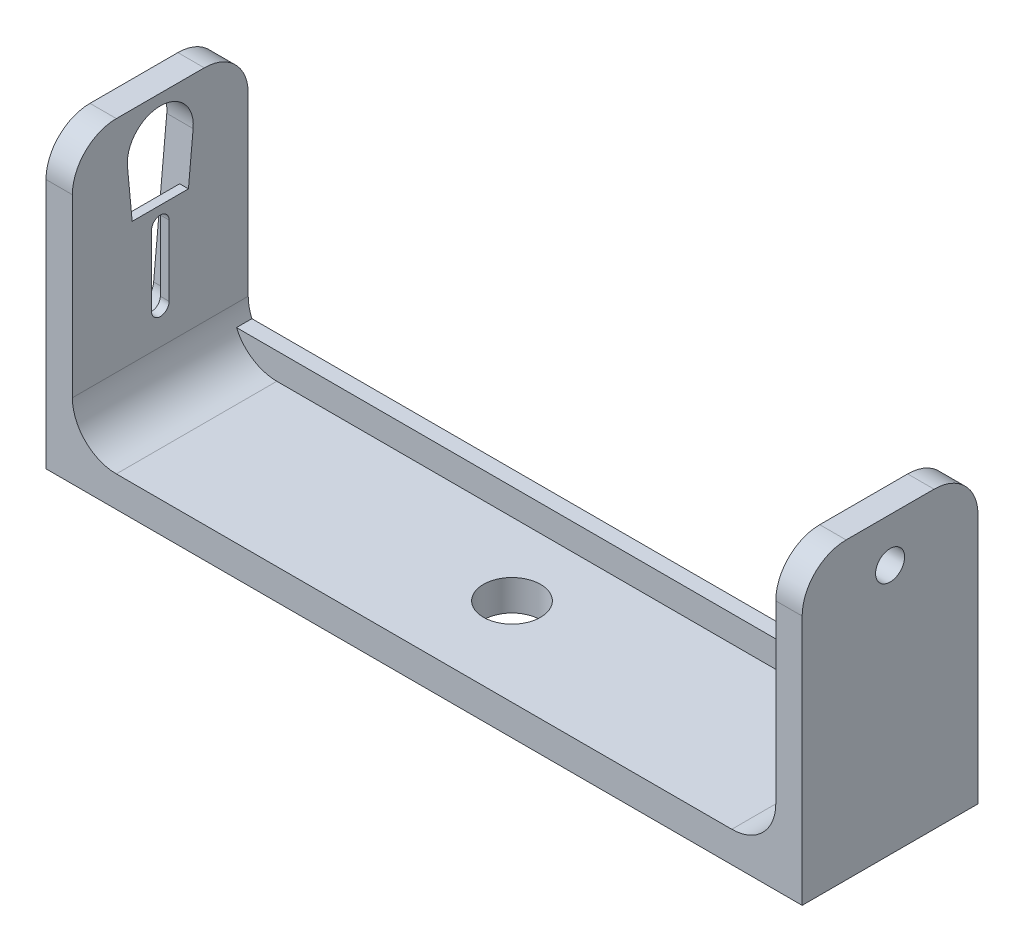
ISO-10303-21;
HEADER;
FILE_DESCRIPTION(('STEP AP214'),'2;1');
FILE_NAME('part.step','',(''),(''),'','','');
FILE_SCHEMA(('AUTOMOTIVE_DESIGN { 1 0 10303 214 1 1 1 1 }'));
ENDSEC;
DATA;
#1=APPLICATION_CONTEXT('core data for automotive mechanical design processes');
#2=APPLICATION_PROTOCOL_DEFINITION('international standard','automotive_design',2000,#1);
#3=PRODUCT_CONTEXT('',#1,'mechanical');
#4=PRODUCT('Part','Part','',(#3));
#5=PRODUCT_RELATED_PRODUCT_CATEGORY('part','',(#4));
#6=PRODUCT_DEFINITION_FORMATION('','',#4);
#7=PRODUCT_DEFINITION_CONTEXT('part definition',#1,'design');
#8=PRODUCT_DEFINITION('design','',#6,#7);
#9=PRODUCT_DEFINITION_SHAPE('','',#8);
#10=(LENGTH_UNIT() NAMED_UNIT(*) SI_UNIT(.MILLI.,.METRE.));
#11=(NAMED_UNIT(*) PLANE_ANGLE_UNIT() SI_UNIT($,.RADIAN.));
#12=(NAMED_UNIT(*) SI_UNIT($,.STERADIAN.) SOLID_ANGLE_UNIT());
#13=UNCERTAINTY_MEASURE_WITH_UNIT(LENGTH_MEASURE(1.E-05),#10,'distance_accuracy_value','');
#14=(GEOMETRIC_REPRESENTATION_CONTEXT(3) GLOBAL_UNCERTAINTY_ASSIGNED_CONTEXT((#13)) GLOBAL_UNIT_ASSIGNED_CONTEXT((#10,
#11,#12)) REPRESENTATION_CONTEXT('',''));
#15=CARTESIAN_POINT('',(0.,0.,0.));
#16=DIRECTION('',(0.,0.,1.));
#17=DIRECTION('',(1.,0.,0.));
#18=AXIS2_PLACEMENT_3D('',#15,#16,#17);
#19=CARTESIAN_POINT('',(0.,3.5,0.));
#20=DIRECTION('',(0.,1.,0.));
#21=DIRECTION('',(0.,0.,1.));
#22=AXIS2_PLACEMENT_3D('',#19,#20,#21);
#23=PLANE('',#22);
#24=CARTESIAN_POINT('',(0.,3.5,0.));
#25=DIRECTION('',(0.,1.,0.));
#26=DIRECTION('',(0.,0.,1.));
#27=AXIS2_PLACEMENT_3D('',#24,#25,#26);
#28=CIRCLE('',#27,3.25);
#29=CARTESIAN_POINT('',(0.,3.5,3.25));
#30=VERTEX_POINT('',#29);
#31=EDGE_CURVE('E399',#30,#30,#28,.T.);
#32=ORIENTED_EDGE('',*,*,#31,.F.);
#33=EDGE_LOOP('',(#32));
#34=FACE_BOUND('',#33,.T.);
#35=DIRECTION('',(0.,0.,1.));
#36=VECTOR('',#35,1.);
#37=CARTESIAN_POINT('',(35.,3.5,0.));
#38=LINE('',#37,#36);
#39=CARTESIAN_POINT('',(35.,3.5,10.));
#40=VERTEX_POINT('',#39);
#41=CARTESIAN_POINT('',(35.,3.5,-8.25));
#42=VERTEX_POINT('',#41);
#43=EDGE_CURVE('E221',#40,#42,#38,.F.);
#44=ORIENTED_EDGE('',*,*,#43,.T.);
#45=DIRECTION('',(1.,0.,0.));
#46=VECTOR('',#45,1.);
#47=CARTESIAN_POINT('',(-40.,3.5,-8.25));
#48=LINE('',#47,#46);
#49=CARTESIAN_POINT('',(-35.,3.5,-8.25));
#50=VERTEX_POINT('',#49);
#51=EDGE_CURVE('E207',#50,#42,#48,.T.);
#52=ORIENTED_EDGE('',*,*,#51,.F.);
#53=DIRECTION('',(0.,0.,-1.));
#54=VECTOR('',#53,1.);
#55=CARTESIAN_POINT('',(-35.,3.5,0.));
#56=LINE('',#55,#54);
#57=CARTESIAN_POINT('',(-35.,3.5,10.));
#58=VERTEX_POINT('',#57);
#59=EDGE_CURVE('E218',#50,#58,#56,.F.);
#60=ORIENTED_EDGE('',*,*,#59,.T.);
#61=DIRECTION('',(1.,0.,0.));
#62=VECTOR('',#61,1.);
#63=CARTESIAN_POINT('',(-43.,3.5,10.));
#64=LINE('',#63,#62);
#65=EDGE_CURVE('E406',#58,#40,#64,.T.);
#66=ORIENTED_EDGE('',*,*,#65,.T.);
#67=EDGE_LOOP('',(#44,#52,#60,#66));
#68=FACE_BOUND('',#67,.T.);
#69=ADVANCED_FACE('F33',(#34,#68),#23,.T.);
#70=CARTESIAN_POINT('',(-35.,8.5,-10.));
#71=DIRECTION('',(0.,0.,-1.));
#72=DIRECTION('',(-1.,0.,0.));
#73=AXIS2_PLACEMENT_3D('',#70,#71,#72);
#74=CYLINDRICAL_SURFACE('',#73,5.);
#75=CARTESIAN_POINT('',(-35.,8.5,-8.25));
#76=DIRECTION('',(0.,0.,-1.));
#77=DIRECTION('',(-1.,0.,0.));
#78=AXIS2_PLACEMENT_3D('',#75,#76,#77);
#79=CIRCLE('',#78,5.);
#80=CARTESIAN_POINT('',(-39.5825756949558,6.5,-8.25));
#81=VERTEX_POINT('',#80);
#82=EDGE_CURVE('E204',#81,#50,#79,.F.);
#83=ORIENTED_EDGE('',*,*,#82,.F.);
#84=DIRECTION('',(0.,0.,-1.));
#85=VECTOR('',#84,1.);
#86=CARTESIAN_POINT('',(-39.5825756949558,6.5,-10.));
#87=LINE('',#86,#85);
#88=CARTESIAN_POINT('',(-39.5825756949558,6.5,-10.));
#89=VERTEX_POINT('',#88);
#90=EDGE_CURVE('E213',#81,#89,#87,.T.);
#91=ORIENTED_EDGE('',*,*,#90,.T.);
#92=CARTESIAN_POINT('',(-35.,8.5,-10.));
#93=DIRECTION('',(0.,0.,1.));
#94=DIRECTION('',(1.,0.,0.));
#95=AXIS2_PLACEMENT_3D('',#92,#93,#94);
#96=CIRCLE('',#95,5.);
#97=CARTESIAN_POINT('',(-40.,8.5,-10.));
#98=VERTEX_POINT('',#97);
#99=EDGE_CURVE('E228',#98,#89,#96,.T.);
#100=ORIENTED_EDGE('',*,*,#99,.F.);
#101=DIRECTION('',(0.,0.,-1.));
#102=VECTOR('',#101,1.);
#103=CARTESIAN_POINT('',(-40.,8.5,-10.));
#104=LINE('',#103,#102);
#105=CARTESIAN_POINT('',(-40.,8.5,10.));
#106=VERTEX_POINT('',#105);
#107=EDGE_CURVE('E229',#106,#98,#104,.T.);
#108=ORIENTED_EDGE('',*,*,#107,.F.);
#109=CARTESIAN_POINT('',(-35.,8.5,10.));
#110=DIRECTION('',(0.,0.,-1.));
#111=DIRECTION('',(-1.,0.,0.));
#112=AXIS2_PLACEMENT_3D('',#109,#110,#111);
#113=CIRCLE('',#112,5.);
#114=EDGE_CURVE('E227',#58,#106,#113,.T.);
#115=ORIENTED_EDGE('',*,*,#114,.F.);
#116=ORIENTED_EDGE('',*,*,#59,.F.);
#117=EDGE_LOOP('',(#83,#91,#100,#108,#115,#116));
#118=FACE_BOUND('',#117,.T.);
#119=ADVANCED_FACE('F224',(#118),#74,.F.);
#120=CARTESIAN_POINT('',(35.,8.5,-10.));
#121=DIRECTION('',(0.,0.,1.));
#122=DIRECTION('',(1.,0.,0.));
#123=AXIS2_PLACEMENT_3D('',#120,#121,#122);
#124=CYLINDRICAL_SURFACE('',#123,5.);
#125=CARTESIAN_POINT('',(35.,8.5,-8.25));
#126=DIRECTION('',(0.,0.,-1.));
#127=DIRECTION('',(-1.,0.,0.));
#128=AXIS2_PLACEMENT_3D('',#125,#126,#127);
#129=CIRCLE('',#128,5.);
#130=CARTESIAN_POINT('',(39.5825756949558,6.5,-8.25));
#131=VERTEX_POINT('',#130);
#132=EDGE_CURVE('E11',#42,#131,#129,.F.);
#133=ORIENTED_EDGE('',*,*,#132,.F.);
#134=ORIENTED_EDGE('',*,*,#43,.F.);
#135=CARTESIAN_POINT('',(35.,8.5,10.));
#136=DIRECTION('',(0.,0.,-1.));
#137=DIRECTION('',(-1.,0.,0.));
#138=AXIS2_PLACEMENT_3D('',#135,#136,#137);
#139=CIRCLE('',#138,5.);
#140=CARTESIAN_POINT('',(40.,8.5,10.));
#141=VERTEX_POINT('',#140);
#142=EDGE_CURVE('E243',#141,#40,#139,.T.);
#143=ORIENTED_EDGE('',*,*,#142,.F.);
#144=DIRECTION('',(0.,0.,1.));
#145=VECTOR('',#144,1.);
#146=CARTESIAN_POINT('',(40.,8.5,-10.));
#147=LINE('',#146,#145);
#148=CARTESIAN_POINT('',(40.,8.5,-10.));
#149=VERTEX_POINT('',#148);
#150=EDGE_CURVE('E239',#149,#141,#147,.T.);
#151=ORIENTED_EDGE('',*,*,#150,.F.);
#152=CARTESIAN_POINT('',(35.,8.5,-10.));
#153=DIRECTION('',(0.,0.,1.));
#154=DIRECTION('',(1.,0.,0.));
#155=AXIS2_PLACEMENT_3D('',#152,#153,#154);
#156=CIRCLE('',#155,5.);
#157=CARTESIAN_POINT('',(39.5825756949558,6.5,-10.));
#158=VERTEX_POINT('',#157);
#159=EDGE_CURVE('E245',#158,#149,#156,.T.);
#160=ORIENTED_EDGE('',*,*,#159,.F.);
#161=DIRECTION('',(0.,0.,1.));
#162=VECTOR('',#161,1.);
#163=CARTESIAN_POINT('',(39.5825756949558,6.5,-10.));
#164=LINE('',#163,#162);
#165=EDGE_CURVE('E41',#158,#131,#164,.T.);
#166=ORIENTED_EDGE('',*,*,#165,.T.);
#167=EDGE_LOOP('',(#133,#134,#143,#151,#160,#166));
#168=FACE_BOUND('',#167,.T.);
#169=ADVANCED_FACE('F285',(#168),#124,.F.);
#170=CARTESIAN_POINT('',(43.,3.5,-10.));
#171=DIRECTION('',(-1.,0.,0.));
#172=DIRECTION('',(0.,0.,1.));
#173=AXIS2_PLACEMENT_3D('',#170,#171,#172);
#174=PLANE('',#173);
#175=CARTESIAN_POINT('',(43.,28.5,0.));
#176=DIRECTION('',(-1.,0.,0.));
#177=DIRECTION('',(0.,0.,1.));
#178=AXIS2_PLACEMENT_3D('',#175,#176,#177);
#179=CIRCLE('',#178,1.65);
#180=CARTESIAN_POINT('',(43.,28.5,1.65));
#181=VERTEX_POINT('',#180);
#182=EDGE_CURVE('E376',#181,#181,#179,.T.);
#183=ORIENTED_EDGE('',*,*,#182,.T.);
#184=EDGE_LOOP('',(#183));
#185=FACE_BOUND('',#184,.T.);
#186=DIRECTION('',(0.,-1.,0.));
#187=VECTOR('',#186,1.);
#188=CARTESIAN_POINT('',(43.,3.5,-10.));
#189=LINE('',#188,#187);
#190=CARTESIAN_POINT('',(43.,28.5,-10.));
#191=VERTEX_POINT('',#190);
#192=CARTESIAN_POINT('',(43.,0.,-10.));
#193=VERTEX_POINT('',#192);
#194=EDGE_CURVE('E234',#191,#193,#189,.T.);
#195=ORIENTED_EDGE('',*,*,#194,.F.);
#196=CARTESIAN_POINT('',(43.,28.5,-5.));
#197=DIRECTION('',(-1.,0.,0.));
#198=DIRECTION('',(0.,0.,1.));
#199=AXIS2_PLACEMENT_3D('',#196,#197,#198);
#200=CIRCLE('',#199,5.);
#201=CARTESIAN_POINT('',(43.,33.5,-5.));
#202=VERTEX_POINT('',#201);
#203=EDGE_CURVE('E263',#191,#202,#200,.F.);
#204=ORIENTED_EDGE('',*,*,#203,.T.);
#205=DIRECTION('',(0.,0.,-1.));
#206=VECTOR('',#205,1.);
#207=CARTESIAN_POINT('',(43.,33.5,-10.));
#208=LINE('',#207,#206);
#209=CARTESIAN_POINT('',(43.,33.5,5.));
#210=VERTEX_POINT('',#209);
#211=EDGE_CURVE('E389',#210,#202,#208,.T.);
#212=ORIENTED_EDGE('',*,*,#211,.F.);
#213=CARTESIAN_POINT('',(43.,28.5,5.));
#214=DIRECTION('',(-1.,0.,0.));
#215=DIRECTION('',(0.,0.,1.));
#216=AXIS2_PLACEMENT_3D('',#213,#214,#215);
#217=CIRCLE('',#216,5.);
#218=CARTESIAN_POINT('',(43.,28.5,10.));
#219=VERTEX_POINT('',#218);
#220=EDGE_CURVE('E261',#210,#219,#217,.F.);
#221=ORIENTED_EDGE('',*,*,#220,.T.);
#222=DIRECTION('',(0.,-1.,0.));
#223=VECTOR('',#222,1.);
#224=CARTESIAN_POINT('',(43.,3.5,10.));
#225=LINE('',#224,#223);
#226=CARTESIAN_POINT('',(43.,0.,10.));
#227=VERTEX_POINT('',#226);
#228=EDGE_CURVE('E408',#219,#227,#225,.T.);
#229=ORIENTED_EDGE('',*,*,#228,.T.);
#230=DIRECTION('',(0.,0.,-1.));
#231=VECTOR('',#230,1.);
#232=CARTESIAN_POINT('',(43.,0.,-10.));
#233=LINE('',#232,#231);
#234=EDGE_CURVE('E403',#227,#193,#233,.T.);
#235=ORIENTED_EDGE('',*,*,#234,.T.);
#236=EDGE_LOOP('',(#195,#204,#212,#221,#229,#235));
#237=FACE_BOUND('',#236,.T.);
#238=ADVANCED_FACE('F435',(#185,#237),#174,.F.);
#239=CARTESIAN_POINT('',(-43.,3.5,-10.));
#240=DIRECTION('',(0.,0.,1.));
#241=DIRECTION('',(1.,0.,0.));
#242=AXIS2_PLACEMENT_3D('',#239,#240,#241);
#243=PLANE('',#242);
#244=DIRECTION('',(-1.,0.,0.));
#245=VECTOR('',#244,1.);
#246=CARTESIAN_POINT('',(-40.,6.5,-10.));
#247=LINE('',#246,#245);
#248=EDGE_CURVE('E289',#158,#89,#247,.T.);
#249=ORIENTED_EDGE('',*,*,#248,.F.);
#250=ORIENTED_EDGE('',*,*,#159,.T.);
#251=DIRECTION('',(0.,-1.,0.));
#252=VECTOR('',#251,1.);
#253=CARTESIAN_POINT('',(40.,33.5,-10.));
#254=LINE('',#253,#252);
#255=CARTESIAN_POINT('',(40.,28.5,-10.));
#256=VERTEX_POINT('',#255);
#257=EDGE_CURVE('E397',#256,#149,#254,.T.);
#258=ORIENTED_EDGE('',*,*,#257,.F.);
#259=DIRECTION('',(-1.,0.,0.));
#260=VECTOR('',#259,1.);
#261=CARTESIAN_POINT('',(43.,28.5,-10.));
#262=LINE('',#261,#260);
#263=EDGE_CURVE('E259',#256,#191,#262,.F.);
#264=ORIENTED_EDGE('',*,*,#263,.T.);
#265=ORIENTED_EDGE('',*,*,#194,.T.);
#266=DIRECTION('',(-1.,0.,0.));
#267=VECTOR('',#266,1.);
#268=CARTESIAN_POINT('',(-43.,0.,-10.));
#269=LINE('',#268,#267);
#270=CARTESIAN_POINT('',(-43.,0.,-10.));
#271=VERTEX_POINT('',#270);
#272=EDGE_CURVE('E412',#193,#271,#269,.T.);
#273=ORIENTED_EDGE('',*,*,#272,.T.);
#274=DIRECTION('',(0.,-1.,0.));
#275=VECTOR('',#274,1.);
#276=CARTESIAN_POINT('',(-43.,3.5,-10.));
#277=LINE('',#276,#275);
#278=CARTESIAN_POINT('',(-43.,28.5,-10.));
#279=VERTEX_POINT('',#278);
#280=EDGE_CURVE('E423',#279,#271,#277,.T.);
#281=ORIENTED_EDGE('',*,*,#280,.F.);
#282=DIRECTION('',(-1.,0.,0.));
#283=VECTOR('',#282,1.);
#284=CARTESIAN_POINT('',(-43.,28.5,-10.));
#285=LINE('',#284,#283);
#286=CARTESIAN_POINT('',(-40.,28.5,-10.));
#287=VERTEX_POINT('',#286);
#288=EDGE_CURVE('E257',#279,#287,#285,.F.);
#289=ORIENTED_EDGE('',*,*,#288,.T.);
#290=DIRECTION('',(0.,-1.,0.));
#291=VECTOR('',#290,1.);
#292=CARTESIAN_POINT('',(-40.,33.5,-10.));
#293=LINE('',#292,#291);
#294=EDGE_CURVE('E385',#287,#98,#293,.T.);
#295=ORIENTED_EDGE('',*,*,#294,.T.);
#296=ORIENTED_EDGE('',*,*,#99,.T.);
#297=EDGE_LOOP('',(#249,#250,#258,#264,#265,#273,#281,#289,#295,#296));
#298=FACE_BOUND('',#297,.T.);
#299=ADVANCED_FACE('F291',(#298),#243,.F.);
#300=CARTESIAN_POINT('',(-43.,3.5,-10.));
#301=DIRECTION('',(1.,0.,0.));
#302=DIRECTION('',(0.,0.,-1.));
#303=AXIS2_PLACEMENT_3D('',#300,#301,#302);
#304=PLANE('',#303);
#305=CARTESIAN_POINT('',(-43.,12.5,0.));
#306=DIRECTION('',(-1.,0.,0.));
#307=DIRECTION('',(0.,0.,1.));
#308=AXIS2_PLACEMENT_3D('',#305,#306,#307);
#309=CIRCLE('',#308,2.25);
#310=CARTESIAN_POINT('',(-43.,12.2890625,-2.24009048279166));
#311=VERTEX_POINT('',#310);
#312=CARTESIAN_POINT('',(-43.,12.2890625,2.24009048279166));
#313=VERTEX_POINT('',#312);
#314=EDGE_CURVE('E357',#311,#313,#309,.T.);
#315=ORIENTED_EDGE('',*,*,#314,.F.);
#316=DIRECTION('',(0.,-0.995595770129625,0.0937499999999998));
#317=VECTOR('',#316,1.);
#318=CARTESIAN_POINT('',(-43.,-0.10107421875,-1.07337668967101));
#319=LINE('',#318,#317);
#320=CARTESIAN_POINT('',(-43.,28.1484375,-3.73348413798609));
#321=VERTEX_POINT('',#320);
#322=EDGE_CURVE('E316',#321,#311,#319,.T.);
#323=ORIENTED_EDGE('',*,*,#322,.F.);
#324=CARTESIAN_POINT('',(-43.,28.5,0.));
#325=DIRECTION('',(-1.,0.,0.));
#326=DIRECTION('',(0.,0.,1.));
#327=AXIS2_PLACEMENT_3D('',#324,#325,#326);
#328=CIRCLE('',#327,3.75);
#329=CARTESIAN_POINT('',(-43.,28.1484375,3.73348413798609));
#330=VERTEX_POINT('',#329);
#331=EDGE_CURVE('E350',#330,#321,#328,.T.);
#332=ORIENTED_EDGE('',*,*,#331,.F.);
#333=DIRECTION('',(0.,-0.995595770129624,-0.09375));
#334=VECTOR('',#333,1.);
#335=CARTESIAN_POINT('',(-43.,-0.10107421875,1.073376689671));
#336=LINE('',#335,#334);
#337=EDGE_CURVE('E360',#330,#313,#336,.T.);
#338=ORIENTED_EDGE('',*,*,#337,.T.);
#339=EDGE_LOOP('',(#315,#323,#332,#338));
#340=FACE_BOUND('',#339,.T.);
#341=DIRECTION('',(0.,0.,1.));
#342=VECTOR('',#341,1.);
#343=CARTESIAN_POINT('',(-43.,33.5,-10.));
#344=LINE('',#343,#342);
#345=CARTESIAN_POINT('',(-43.,33.5,-5.));
#346=VERTEX_POINT('',#345);
#347=CARTESIAN_POINT('',(-43.,33.5,5.));
#348=VERTEX_POINT('',#347);
#349=EDGE_CURVE('E379',#346,#348,#344,.T.);
#350=ORIENTED_EDGE('',*,*,#349,.F.);
#351=CARTESIAN_POINT('',(-43.,28.5,-5.));
#352=DIRECTION('',(1.,0.,0.));
#353=DIRECTION('',(0.,0.,-1.));
#354=AXIS2_PLACEMENT_3D('',#351,#352,#353);
#355=CIRCLE('',#354,5.);
#356=EDGE_CURVE('E277',#346,#279,#355,.F.);
#357=ORIENTED_EDGE('',*,*,#356,.T.);
#358=ORIENTED_EDGE('',*,*,#280,.T.);
#359=DIRECTION('',(0.,0.,1.));
#360=VECTOR('',#359,1.);
#361=CARTESIAN_POINT('',(-43.,0.,-10.));
#362=LINE('',#361,#360);
#363=CARTESIAN_POINT('',(-43.,0.,10.));
#364=VERTEX_POINT('',#363);
#365=EDGE_CURVE('E415',#271,#364,#362,.T.);
#366=ORIENTED_EDGE('',*,*,#365,.T.);
#367=DIRECTION('',(0.,-1.,0.));
#368=VECTOR('',#367,1.);
#369=CARTESIAN_POINT('',(-43.,3.5,10.));
#370=LINE('',#369,#368);
#371=CARTESIAN_POINT('',(-43.,28.5,10.));
#372=VERTEX_POINT('',#371);
#373=EDGE_CURVE('E421',#372,#364,#370,.T.);
#374=ORIENTED_EDGE('',*,*,#373,.F.);
#375=CARTESIAN_POINT('',(-43.,28.5,5.));
#376=DIRECTION('',(1.,0.,0.));
#377=DIRECTION('',(0.,0.,-1.));
#378=AXIS2_PLACEMENT_3D('',#375,#376,#377);
#379=CIRCLE('',#378,5.);
#380=EDGE_CURVE('E275',#372,#348,#379,.F.);
#381=ORIENTED_EDGE('',*,*,#380,.T.);
#382=EDGE_LOOP('',(#350,#357,#358,#366,#374,#381));
#383=FACE_BOUND('',#382,.T.);
#384=ADVANCED_FACE('F447',(#340,#383),#304,.F.);
#385=CARTESIAN_POINT('',(-43.,3.5,10.));
#386=DIRECTION('',(0.,0.,-1.));
#387=DIRECTION('',(-1.,0.,0.));
#388=AXIS2_PLACEMENT_3D('',#385,#386,#387);
#389=PLANE('',#388);
#390=ORIENTED_EDGE('',*,*,#228,.F.);
#391=DIRECTION('',(1.,0.,0.));
#392=VECTOR('',#391,1.);
#393=CARTESIAN_POINT('',(40.,28.5,10.));
#394=LINE('',#393,#392);
#395=CARTESIAN_POINT('',(40.,28.5,10.));
#396=VERTEX_POINT('',#395);
#397=EDGE_CURVE('E267',#219,#396,#394,.F.);
#398=ORIENTED_EDGE('',*,*,#397,.T.);
#399=DIRECTION('',(0.,-1.,0.));
#400=VECTOR('',#399,1.);
#401=CARTESIAN_POINT('',(40.,33.5,10.));
#402=LINE('',#401,#400);
#403=EDGE_CURVE('E395',#396,#141,#402,.T.);
#404=ORIENTED_EDGE('',*,*,#403,.T.);
#405=ORIENTED_EDGE('',*,*,#142,.T.);
#406=ORIENTED_EDGE('',*,*,#65,.F.);
#407=ORIENTED_EDGE('',*,*,#114,.T.);
#408=DIRECTION('',(0.,-1.,0.));
#409=VECTOR('',#408,1.);
#410=CARTESIAN_POINT('',(-40.,33.5,10.));
#411=LINE('',#410,#409);
#412=CARTESIAN_POINT('',(-40.,28.5,10.));
#413=VERTEX_POINT('',#412);
#414=EDGE_CURVE('E387',#413,#106,#411,.T.);
#415=ORIENTED_EDGE('',*,*,#414,.F.);
#416=DIRECTION('',(1.,0.,0.));
#417=VECTOR('',#416,1.);
#418=CARTESIAN_POINT('',(-43.,28.5,10.));
#419=LINE('',#418,#417);
#420=EDGE_CURVE('E265',#413,#372,#419,.F.);
#421=ORIENTED_EDGE('',*,*,#420,.T.);
#422=ORIENTED_EDGE('',*,*,#373,.T.);
#423=DIRECTION('',(1.,0.,0.));
#424=VECTOR('',#423,1.);
#425=CARTESIAN_POINT('',(-43.,0.,10.));
#426=LINE('',#425,#424);
#427=EDGE_CURVE('E409',#364,#227,#426,.T.);
#428=ORIENTED_EDGE('',*,*,#427,.T.);
#429=EDGE_LOOP('',(#390,#398,#404,#405,#406,#407,#415,#421,#422,#428));
#430=FACE_BOUND('',#429,.T.);
#431=ADVANCED_FACE('F440',(#430),#389,.F.);
#432=CARTESIAN_POINT('',(0.,0.,0.));
#433=DIRECTION('',(0.,1.,0.));
#434=DIRECTION('',(0.,0.,1.));
#435=AXIS2_PLACEMENT_3D('',#432,#433,#434);
#436=PLANE('',#435);
#437=CARTESIAN_POINT('',(0.,0.,0.));
#438=DIRECTION('',(0.,1.,0.));
#439=DIRECTION('',(0.,0.,1.));
#440=AXIS2_PLACEMENT_3D('',#437,#438,#439);
#441=CIRCLE('',#440,3.25);
#442=CARTESIAN_POINT('',(0.,0.,3.25));
#443=VERTEX_POINT('',#442);
#444=EDGE_CURVE('E400',#443,#443,#441,.T.);
#445=ORIENTED_EDGE('',*,*,#444,.T.);
#446=EDGE_LOOP('',(#445));
#447=FACE_BOUND('',#446,.T.);
#448=ORIENTED_EDGE('',*,*,#234,.F.);
#449=ORIENTED_EDGE('',*,*,#427,.F.);
#450=ORIENTED_EDGE('',*,*,#365,.F.);
#451=ORIENTED_EDGE('',*,*,#272,.F.);
#452=EDGE_LOOP('',(#448,#449,#450,#451));
#453=FACE_BOUND('',#452,.T.);
#454=ADVANCED_FACE('F433',(#447,#453),#436,.F.);
#455=CARTESIAN_POINT('',(0.,0.,0.));
#456=DIRECTION('',(0.,1.,0.));
#457=DIRECTION('',(0.,0.,1.));
#458=AXIS2_PLACEMENT_3D('',#455,#456,#457);
#459=CYLINDRICAL_SURFACE('',#458,3.25);
#460=ORIENTED_EDGE('',*,*,#444,.F.);
#461=EDGE_LOOP('',(#460));
#462=FACE_BOUND('',#461,.T.);
#463=ORIENTED_EDGE('',*,*,#31,.T.);
#464=EDGE_LOOP('',(#463));
#465=FACE_BOUND('',#464,.T.);
#466=ADVANCED_FACE('F493',(#462,#465),#459,.F.);
#467=CARTESIAN_POINT('',(40.,33.5,-10.));
#468=DIRECTION('',(1.,0.,0.));
#469=DIRECTION('',(0.,0.,-1.));
#470=AXIS2_PLACEMENT_3D('',#467,#468,#469);
#471=PLANE('',#470);
#472=CARTESIAN_POINT('',(40.,28.5,0.));
#473=DIRECTION('',(1.,0.,0.));
#474=DIRECTION('',(0.,0.,-1.));
#475=AXIS2_PLACEMENT_3D('',#472,#473,#474);
#476=CIRCLE('',#475,1.65);
#477=CARTESIAN_POINT('',(40.,28.5,-1.65));
#478=VERTEX_POINT('',#477);
#479=EDGE_CURVE('E367',#478,#478,#476,.T.);
#480=ORIENTED_EDGE('',*,*,#479,.T.);
#481=EDGE_LOOP('',(#480));
#482=FACE_BOUND('',#481,.T.);
#483=DIRECTION('',(0.,0.,1.));
#484=VECTOR('',#483,1.);
#485=CARTESIAN_POINT('',(40.,33.5,-10.));
#486=LINE('',#485,#484);
#487=CARTESIAN_POINT('',(40.,33.5,-5.));
#488=VERTEX_POINT('',#487);
#489=CARTESIAN_POINT('',(40.,33.5,5.));
#490=VERTEX_POINT('',#489);
#491=EDGE_CURVE('E392',#488,#490,#486,.T.);
#492=ORIENTED_EDGE('',*,*,#491,.F.);
#493=CARTESIAN_POINT('',(40.,28.5,-5.));
#494=DIRECTION('',(1.,0.,0.));
#495=DIRECTION('',(0.,0.,-1.));
#496=AXIS2_PLACEMENT_3D('',#493,#494,#495);
#497=CIRCLE('',#496,5.);
#498=EDGE_CURVE('E255',#488,#256,#497,.F.);
#499=ORIENTED_EDGE('',*,*,#498,.T.);
#500=ORIENTED_EDGE('',*,*,#257,.T.);
#501=ORIENTED_EDGE('',*,*,#150,.T.);
#502=ORIENTED_EDGE('',*,*,#403,.F.);
#503=CARTESIAN_POINT('',(40.,28.5,5.));
#504=DIRECTION('',(1.,0.,0.));
#505=DIRECTION('',(0.,0.,-1.));
#506=AXIS2_PLACEMENT_3D('',#503,#504,#505);
#507=CIRCLE('',#506,5.);
#508=EDGE_CURVE('E253',#396,#490,#507,.F.);
#509=ORIENTED_EDGE('',*,*,#508,.T.);
#510=EDGE_LOOP('',(#492,#499,#500,#501,#502,#509));
#511=FACE_BOUND('',#510,.T.);
#512=ADVANCED_FACE('F465',(#482,#511),#471,.F.);
#513=CARTESIAN_POINT('',(0.,33.5,0.));
#514=DIRECTION('',(0.,1.,0.));
#515=DIRECTION('',(0.,0.,1.));
#516=AXIS2_PLACEMENT_3D('',#513,#514,#515);
#517=PLANE('',#516);
#518=ORIENTED_EDGE('',*,*,#211,.T.);
#519=DIRECTION('',(-1.,0.,0.));
#520=VECTOR('',#519,1.);
#521=CARTESIAN_POINT('',(40.,33.5,-5.));
#522=LINE('',#521,#520);
#523=EDGE_CURVE('E250',#202,#488,#522,.T.);
#524=ORIENTED_EDGE('',*,*,#523,.T.);
#525=ORIENTED_EDGE('',*,*,#491,.T.);
#526=DIRECTION('',(1.,0.,0.));
#527=VECTOR('',#526,1.);
#528=CARTESIAN_POINT('',(43.,33.5,5.));
#529=LINE('',#528,#527);
#530=EDGE_CURVE('E247',#490,#210,#529,.T.);
#531=ORIENTED_EDGE('',*,*,#530,.T.);
#532=EDGE_LOOP('',(#518,#524,#525,#531));
#533=FACE_BOUND('',#532,.T.);
#534=ADVANCED_FACE('F471',(#533),#517,.T.);
#535=CARTESIAN_POINT('',(-40.,33.5,-10.));
#536=DIRECTION('',(-1.,0.,0.));
#537=DIRECTION('',(0.,0.,1.));
#538=AXIS2_PLACEMENT_3D('',#535,#536,#537);
#539=PLANE('',#538);
#540=DIRECTION('',(0.,0.995595770129625,0.09375));
#541=VECTOR('',#540,1.);
#542=CARTESIAN_POINT('',(-40.,-0.10107421875,1.073376689671));
#543=LINE('',#542,#541);
#544=CARTESIAN_POINT('',(-40.,22.4768783038356,3.19942333681256));
#545=VERTEX_POINT('',#544);
#546=CARTESIAN_POINT('',(-40.,28.1484375,3.73348413798609));
#547=VERTEX_POINT('',#546);
#548=EDGE_CURVE('E307',#545,#547,#543,.T.);
#549=ORIENTED_EDGE('',*,*,#548,.T.);
#550=CARTESIAN_POINT('',(-40.,28.5,0.));
#551=DIRECTION('',(-1.,0.,0.));
#552=DIRECTION('',(0.,0.,1.));
#553=AXIS2_PLACEMENT_3D('',#550,#551,#552);
#554=CIRCLE('',#553,3.75);
#555=CARTESIAN_POINT('',(-40.,28.1484375,-3.73348413798609));
#556=VERTEX_POINT('',#555);
#557=EDGE_CURVE('E299',#547,#556,#554,.T.);
#558=ORIENTED_EDGE('',*,*,#557,.T.);
#559=DIRECTION('',(0.,-0.995595770129625,0.0937499999999998));
#560=VECTOR('',#559,1.);
#561=CARTESIAN_POINT('',(-40.,-0.10107421875,-1.07337668967101));
#562=LINE('',#561,#560);
#563=CARTESIAN_POINT('',(-40.,22.4768783038356,-3.19942333681256));
#564=VERTEX_POINT('',#563);
#565=EDGE_CURVE('E302',#556,#564,#562,.T.);
#566=ORIENTED_EDGE('',*,*,#565,.T.);
#567=DIRECTION('',(0.,0.,1.));
#568=VECTOR('',#567,1.);
#569=CARTESIAN_POINT('',(-40.,22.4768783038356,0.));
#570=LINE('',#569,#568);
#571=EDGE_CURVE('E55',#564,#545,#570,.T.);
#572=ORIENTED_EDGE('',*,*,#571,.T.);
#573=EDGE_LOOP('',(#549,#558,#566,#572));
#574=FACE_BOUND('',#573,.T.);
#575=DIRECTION('',(0.,-1.,0.));
#576=VECTOR('',#575,1.);
#577=CARTESIAN_POINT('',(-40.,20.5,1.));
#578=LINE('',#577,#576);
#579=CARTESIAN_POINT('',(-40.,20.5,1.));
#580=VERTEX_POINT('',#579);
#581=CARTESIAN_POINT('',(-40.,12.5,1.));
#582=VERTEX_POINT('',#581);
#583=EDGE_CURVE('E321',#580,#582,#578,.T.);
#584=ORIENTED_EDGE('',*,*,#583,.F.);
#585=CARTESIAN_POINT('',(-40.,20.5,0.));
#586=DIRECTION('',(-1.,0.,0.));
#587=DIRECTION('',(0.,0.,1.));
#588=AXIS2_PLACEMENT_3D('',#585,#586,#587);
#589=CIRCLE('',#588,1.);
#590=CARTESIAN_POINT('',(-40.,20.5,-1.));
#591=VERTEX_POINT('',#590);
#592=EDGE_CURVE('E331',#580,#591,#589,.T.);
#593=ORIENTED_EDGE('',*,*,#592,.T.);
#594=DIRECTION('',(0.,-1.,0.));
#595=VECTOR('',#594,1.);
#596=CARTESIAN_POINT('',(-40.,20.5,-1.));
#597=LINE('',#596,#595);
#598=CARTESIAN_POINT('',(-40.,12.5,-0.999999999999997));
#599=VERTEX_POINT('',#598);
#600=EDGE_CURVE('E342',#591,#599,#597,.T.);
#601=ORIENTED_EDGE('',*,*,#600,.T.);
#602=CARTESIAN_POINT('',(-40.,12.5,0.));
#603=DIRECTION('',(-1.,0.,0.));
#604=DIRECTION('',(0.,0.,1.));
#605=AXIS2_PLACEMENT_3D('',#602,#603,#604);
#606=CIRCLE('',#605,1.);
#607=EDGE_CURVE('E339',#599,#582,#606,.T.);
#608=ORIENTED_EDGE('',*,*,#607,.T.);
#609=EDGE_LOOP('',(#584,#593,#601,#608));
#610=FACE_BOUND('',#609,.T.);
#611=ORIENTED_EDGE('',*,*,#294,.F.);
#612=CARTESIAN_POINT('',(-40.,28.5,-5.));
#613=DIRECTION('',(-1.,0.,0.));
#614=DIRECTION('',(0.,0.,1.));
#615=AXIS2_PLACEMENT_3D('',#612,#613,#614);
#616=CIRCLE('',#615,5.);
#617=CARTESIAN_POINT('',(-40.,33.5,-5.));
#618=VERTEX_POINT('',#617);
#619=EDGE_CURVE('E281',#287,#618,#616,.F.);
#620=ORIENTED_EDGE('',*,*,#619,.T.);
#621=DIRECTION('',(0.,0.,-1.));
#622=VECTOR('',#621,1.);
#623=CARTESIAN_POINT('',(-40.,33.5,-10.));
#624=LINE('',#623,#622);
#625=CARTESIAN_POINT('',(-40.,33.5,5.));
#626=VERTEX_POINT('',#625);
#627=EDGE_CURVE('E382',#626,#618,#624,.T.);
#628=ORIENTED_EDGE('',*,*,#627,.F.);
#629=CARTESIAN_POINT('',(-40.,28.5,5.));
#630=DIRECTION('',(-1.,0.,0.));
#631=DIRECTION('',(0.,0.,1.));
#632=AXIS2_PLACEMENT_3D('',#629,#630,#631);
#633=CIRCLE('',#632,5.);
#634=EDGE_CURVE('E279',#626,#413,#633,.F.);
#635=ORIENTED_EDGE('',*,*,#634,.T.);
#636=ORIENTED_EDGE('',*,*,#414,.T.);
#637=ORIENTED_EDGE('',*,*,#107,.T.);
#638=EDGE_LOOP('',(#611,#620,#628,#635,#636,#637));
#639=FACE_BOUND('',#638,.T.);
#640=ADVANCED_FACE('F456',(#574,#610,#639),#539,.F.);
#641=CARTESIAN_POINT('',(0.,33.5,0.));
#642=DIRECTION('',(0.,-1.,0.));
#643=DIRECTION('',(0.,0.,-1.));
#644=AXIS2_PLACEMENT_3D('',#641,#642,#643);
#645=PLANE('',#644);
#646=ORIENTED_EDGE('',*,*,#627,.T.);
#647=DIRECTION('',(-1.,0.,0.));
#648=VECTOR('',#647,1.);
#649=CARTESIAN_POINT('',(0.,33.5,-5.));
#650=LINE('',#649,#648);
#651=EDGE_CURVE('E272',#618,#346,#650,.T.);
#652=ORIENTED_EDGE('',*,*,#651,.T.);
#653=ORIENTED_EDGE('',*,*,#349,.T.);
#654=DIRECTION('',(1.,0.,0.));
#655=VECTOR('',#654,1.);
#656=CARTESIAN_POINT('',(0.,33.5,5.));
#657=LINE('',#656,#655);
#658=EDGE_CURVE('E269',#348,#626,#657,.T.);
#659=ORIENTED_EDGE('',*,*,#658,.T.);
#660=EDGE_LOOP('',(#646,#652,#653,#659));
#661=FACE_BOUND('',#660,.T.);
#662=ADVANCED_FACE('F458',(#661),#645,.F.);
#663=CARTESIAN_POINT('',(48.,28.5,0.));
#664=DIRECTION('',(-1.,0.,0.));
#665=DIRECTION('',(0.,0.,1.));
#666=AXIS2_PLACEMENT_3D('',#663,#664,#665);
#667=CYLINDRICAL_SURFACE('',#666,1.65);
#668=ORIENTED_EDGE('',*,*,#479,.F.);
#669=EDGE_LOOP('',(#668));
#670=FACE_BOUND('',#669,.T.);
#671=ORIENTED_EDGE('',*,*,#182,.F.);
#672=EDGE_LOOP('',(#671));
#673=FACE_BOUND('',#672,.T.);
#674=ADVANCED_FACE('F481',(#670,#673),#667,.F.);
#675=CARTESIAN_POINT('',(0.,28.5,-5.));
#676=DIRECTION('',(1.,0.,0.));
#677=DIRECTION('',(0.,0.,-1.));
#678=AXIS2_PLACEMENT_3D('',#675,#676,#677);
#679=CYLINDRICAL_SURFACE('',#678,5.);
#680=ORIENTED_EDGE('',*,*,#203,.F.);
#681=ORIENTED_EDGE('',*,*,#263,.F.);
#682=ORIENTED_EDGE('',*,*,#498,.F.);
#683=ORIENTED_EDGE('',*,*,#523,.F.);
#684=EDGE_LOOP('',(#680,#681,#682,#683));
#685=FACE_BOUND('',#684,.T.);
#686=ADVANCED_FACE('F468',(#685),#679,.T.);
#687=CARTESIAN_POINT('',(0.,28.5,5.));
#688=DIRECTION('',(-1.,0.,0.));
#689=DIRECTION('',(0.,0.,1.));
#690=AXIS2_PLACEMENT_3D('',#687,#688,#689);
#691=CYLINDRICAL_SURFACE('',#690,5.);
#692=ORIENTED_EDGE('',*,*,#508,.F.);
#693=ORIENTED_EDGE('',*,*,#397,.F.);
#694=ORIENTED_EDGE('',*,*,#220,.F.);
#695=ORIENTED_EDGE('',*,*,#530,.F.);
#696=EDGE_LOOP('',(#692,#693,#694,#695));
#697=FACE_BOUND('',#696,.T.);
#698=ADVANCED_FACE('F474',(#697),#691,.T.);
#699=CARTESIAN_POINT('',(0.,28.5,-5.));
#700=DIRECTION('',(-1.,0.,0.));
#701=DIRECTION('',(0.,0.,1.));
#702=AXIS2_PLACEMENT_3D('',#699,#700,#701);
#703=CYLINDRICAL_SURFACE('',#702,5.);
#704=ORIENTED_EDGE('',*,*,#619,.F.);
#705=ORIENTED_EDGE('',*,*,#288,.F.);
#706=ORIENTED_EDGE('',*,*,#356,.F.);
#707=ORIENTED_EDGE('',*,*,#651,.F.);
#708=EDGE_LOOP('',(#704,#705,#706,#707));
#709=FACE_BOUND('',#708,.T.);
#710=ADVANCED_FACE('F452',(#709),#703,.T.);
#711=CARTESIAN_POINT('',(0.,28.5,5.));
#712=DIRECTION('',(1.,0.,0.));
#713=DIRECTION('',(0.,0.,-1.));
#714=AXIS2_PLACEMENT_3D('',#711,#712,#713);
#715=CYLINDRICAL_SURFACE('',#714,5.);
#716=ORIENTED_EDGE('',*,*,#380,.F.);
#717=ORIENTED_EDGE('',*,*,#420,.F.);
#718=ORIENTED_EDGE('',*,*,#634,.F.);
#719=ORIENTED_EDGE('',*,*,#658,.F.);
#720=EDGE_LOOP('',(#716,#717,#718,#719));
#721=FACE_BOUND('',#720,.T.);
#722=ADVANCED_FACE('F35',(#721),#715,.T.);
#723=CARTESIAN_POINT('',(-41.,-0.10107421875,-1.07337668967101));
#724=DIRECTION('',(0.,-0.0937499999999998,-0.995595770129625));
#725=DIRECTION('',(0.,0.995595770129625,-0.0937499999999998));
#726=AXIS2_PLACEMENT_3D('',#723,#724,#725);
#727=PLANE('',#726);
#728=ORIENTED_EDGE('',*,*,#322,.T.);
#729=DIRECTION('',(-1.,0.,0.));
#730=VECTOR('',#729,1.);
#731=CARTESIAN_POINT('',(-41.,12.2890625,-2.24009048279166));
#732=LINE('',#731,#730);
#733=CARTESIAN_POINT('',(-41.,12.2890625,-2.24009048279166));
#734=VERTEX_POINT('',#733);
#735=EDGE_CURVE('E355',#734,#311,#732,.T.);
#736=ORIENTED_EDGE('',*,*,#735,.F.);
#737=DIRECTION('',(0.,-0.995595770129625,0.0937499999999998));
#738=VECTOR('',#737,1.);
#739=CARTESIAN_POINT('',(-41.,-0.10107421875,-1.07337668967101));
#740=LINE('',#739,#738);
#741=CARTESIAN_POINT('',(-41.,22.4768783038356,-3.19942333681256));
#742=VERTEX_POINT('',#741);
#743=EDGE_CURVE('E347',#742,#734,#740,.T.);
#744=ORIENTED_EDGE('',*,*,#743,.F.);
#745=DIRECTION('',(-1.,0.,0.));
#746=VECTOR('',#745,1.);
#747=CARTESIAN_POINT('',(-40.,22.4768783038356,-3.19942333681256));
#748=LINE('',#747,#746);
#749=EDGE_CURVE('E310',#564,#742,#748,.T.);
#750=ORIENTED_EDGE('',*,*,#749,.F.);
#751=ORIENTED_EDGE('',*,*,#565,.F.);
#752=DIRECTION('',(-1.,0.,0.));
#753=VECTOR('',#752,1.);
#754=CARTESIAN_POINT('',(-41.,28.1484375,-3.73348413798609));
#755=LINE('',#754,#753);
#756=EDGE_CURVE('E365',#556,#321,#755,.T.);
#757=ORIENTED_EDGE('',*,*,#756,.T.);
#758=EDGE_LOOP('',(#728,#736,#744,#750,#751,#757));
#759=FACE_BOUND('',#758,.T.);
#760=ADVANCED_FACE('F596',(#759),#727,.F.);
#761=CARTESIAN_POINT('',(-41.,28.5,0.));
#762=DIRECTION('',(-1.,0.,0.));
#763=DIRECTION('',(0.,0.,1.));
#764=AXIS2_PLACEMENT_3D('',#761,#762,#763);
#765=CYLINDRICAL_SURFACE('',#764,3.75);
#766=ORIENTED_EDGE('',*,*,#331,.T.);
#767=ORIENTED_EDGE('',*,*,#756,.F.);
#768=ORIENTED_EDGE('',*,*,#557,.F.);
#769=DIRECTION('',(-1.,0.,0.));
#770=VECTOR('',#769,1.);
#771=CARTESIAN_POINT('',(-41.,28.1484375,3.73348413798609));
#772=LINE('',#771,#770);
#773=EDGE_CURVE('E368',#547,#330,#772,.T.);
#774=ORIENTED_EDGE('',*,*,#773,.T.);
#775=EDGE_LOOP('',(#766,#767,#768,#774));
#776=FACE_BOUND('',#775,.T.);
#777=ADVANCED_FACE('F604',(#776),#765,.F.);
#778=CARTESIAN_POINT('',(-41.,-0.10107421875,1.073376689671));
#779=DIRECTION('',(0.,0.09375,-0.995595770129625));
#780=DIRECTION('',(0.,0.995595770129625,0.09375));
#781=AXIS2_PLACEMENT_3D('',#778,#779,#780);
#782=PLANE('',#781);
#783=ORIENTED_EDGE('',*,*,#337,.F.);
#784=ORIENTED_EDGE('',*,*,#773,.F.);
#785=ORIENTED_EDGE('',*,*,#548,.F.);
#786=DIRECTION('',(-1.,0.,0.));
#787=VECTOR('',#786,1.);
#788=CARTESIAN_POINT('',(-40.,22.4768783038356,3.19942333681256));
#789=LINE('',#788,#787);
#790=CARTESIAN_POINT('',(-41.,22.4768783038356,3.19942333681256));
#791=VERTEX_POINT('',#790);
#792=EDGE_CURVE('E314',#545,#791,#789,.T.);
#793=ORIENTED_EDGE('',*,*,#792,.T.);
#794=DIRECTION('',(0.,-0.995595770129624,-0.09375));
#795=VECTOR('',#794,1.);
#796=CARTESIAN_POINT('',(-41.,-0.10107421875,1.073376689671));
#797=LINE('',#796,#795);
#798=CARTESIAN_POINT('',(-41.,12.2890625,2.24009048279166));
#799=VERTEX_POINT('',#798);
#800=EDGE_CURVE('E353',#791,#799,#797,.T.);
#801=ORIENTED_EDGE('',*,*,#800,.T.);
#802=DIRECTION('',(-1.,0.,0.));
#803=VECTOR('',#802,1.);
#804=CARTESIAN_POINT('',(-41.,12.2890625,2.24009048279166));
#805=LINE('',#804,#803);
#806=EDGE_CURVE('E370',#799,#313,#805,.T.);
#807=ORIENTED_EDGE('',*,*,#806,.T.);
#808=EDGE_LOOP('',(#783,#784,#785,#793,#801,#807));
#809=FACE_BOUND('',#808,.T.);
#810=ADVANCED_FACE('F612',(#809),#782,.T.);
#811=CARTESIAN_POINT('',(-41.,12.5,0.));
#812=DIRECTION('',(-1.,0.,0.));
#813=DIRECTION('',(0.,0.,1.));
#814=AXIS2_PLACEMENT_3D('',#811,#812,#813);
#815=CYLINDRICAL_SURFACE('',#814,2.25);
#816=ORIENTED_EDGE('',*,*,#314,.T.);
#817=ORIENTED_EDGE('',*,*,#806,.F.);
#818=CARTESIAN_POINT('',(-41.,12.5,0.));
#819=DIRECTION('',(-1.,0.,0.));
#820=DIRECTION('',(0.,0.,1.));
#821=AXIS2_PLACEMENT_3D('',#818,#819,#820);
#822=CIRCLE('',#821,2.25);
#823=EDGE_CURVE('E349',#734,#799,#822,.T.);
#824=ORIENTED_EDGE('',*,*,#823,.F.);
#825=ORIENTED_EDGE('',*,*,#735,.T.);
#826=EDGE_LOOP('',(#816,#817,#824,#825));
#827=FACE_BOUND('',#826,.T.);
#828=ADVANCED_FACE('F620',(#827),#815,.F.);
#829=CARTESIAN_POINT('',(-41.,0.,0.));
#830=DIRECTION('',(-1.,0.,0.));
#831=DIRECTION('',(0.,0.,1.));
#832=AXIS2_PLACEMENT_3D('',#829,#830,#831);
#833=PLANE('',#832);
#834=DIRECTION('',(0.,0.,1.));
#835=VECTOR('',#834,1.);
#836=CARTESIAN_POINT('',(-41.,22.4768783038356,0.));
#837=LINE('',#836,#835);
#838=EDGE_CURVE('E303',#742,#791,#837,.T.);
#839=ORIENTED_EDGE('',*,*,#838,.F.);
#840=ORIENTED_EDGE('',*,*,#743,.T.);
#841=ORIENTED_EDGE('',*,*,#823,.T.);
#842=ORIENTED_EDGE('',*,*,#800,.F.);
#843=EDGE_LOOP('',(#839,#840,#841,#842));
#844=FACE_BOUND('',#843,.T.);
#845=CARTESIAN_POINT('',(-41.,20.5,0.));
#846=DIRECTION('',(-1.,0.,0.));
#847=DIRECTION('',(0.,0.,1.));
#848=AXIS2_PLACEMENT_3D('',#845,#846,#847);
#849=CIRCLE('',#848,1.);
#850=CARTESIAN_POINT('',(-41.,20.5,1.));
#851=VERTEX_POINT('',#850);
#852=CARTESIAN_POINT('',(-41.,20.5,-1.));
#853=VERTEX_POINT('',#852);
#854=EDGE_CURVE('E313',#851,#853,#849,.T.);
#855=ORIENTED_EDGE('',*,*,#854,.F.);
#856=DIRECTION('',(0.,-1.,0.));
#857=VECTOR('',#856,1.);
#858=CARTESIAN_POINT('',(-41.,20.5,1.));
#859=LINE('',#858,#857);
#860=CARTESIAN_POINT('',(-41.,12.5,1.));
#861=VERTEX_POINT('',#860);
#862=EDGE_CURVE('E327',#851,#861,#859,.T.);
#863=ORIENTED_EDGE('',*,*,#862,.T.);
#864=CARTESIAN_POINT('',(-41.,12.5,0.));
#865=DIRECTION('',(-1.,0.,0.));
#866=DIRECTION('',(0.,0.,1.));
#867=AXIS2_PLACEMENT_3D('',#864,#865,#866);
#868=CIRCLE('',#867,1.);
#869=CARTESIAN_POINT('',(-41.,12.5,-0.999999999999999));
#870=VERTEX_POINT('',#869);
#871=EDGE_CURVE('E330',#870,#861,#868,.T.);
#872=ORIENTED_EDGE('',*,*,#871,.F.);
#873=DIRECTION('',(0.,-1.,0.));
#874=VECTOR('',#873,1.);
#875=CARTESIAN_POINT('',(-41.,20.5,-1.));
#876=LINE('',#875,#874);
#877=EDGE_CURVE('E334',#853,#870,#876,.T.);
#878=ORIENTED_EDGE('',*,*,#877,.F.);
#879=EDGE_LOOP('',(#855,#863,#872,#878));
#880=FACE_BOUND('',#879,.T.);
#881=ADVANCED_FACE('F628',(#844,#880),#833,.T.);
#882=CARTESIAN_POINT('',(-40.,20.5,0.));
#883=DIRECTION('',(-1.,0.,0.));
#884=DIRECTION('',(0.,0.,1.));
#885=AXIS2_PLACEMENT_3D('',#882,#883,#884);
#886=CYLINDRICAL_SURFACE('',#885,1.);
#887=ORIENTED_EDGE('',*,*,#854,.T.);
#888=DIRECTION('',(-1.,0.,0.));
#889=VECTOR('',#888,1.);
#890=CARTESIAN_POINT('',(-40.,20.5,-1.));
#891=LINE('',#890,#889);
#892=EDGE_CURVE('E318',#591,#853,#891,.T.);
#893=ORIENTED_EDGE('',*,*,#892,.F.);
#894=ORIENTED_EDGE('',*,*,#592,.F.);
#895=DIRECTION('',(-1.,0.,0.));
#896=VECTOR('',#895,1.);
#897=CARTESIAN_POINT('',(-40.,20.5,1.));
#898=LINE('',#897,#896);
#899=EDGE_CURVE('E212',#580,#851,#898,.T.);
#900=ORIENTED_EDGE('',*,*,#899,.T.);
#901=EDGE_LOOP('',(#887,#893,#894,#900));
#902=FACE_BOUND('',#901,.T.);
#903=ADVANCED_FACE('F635',(#902),#886,.F.);
#904=CARTESIAN_POINT('',(-40.,20.5,1.));
#905=DIRECTION('',(0.,0.,-1.));
#906=DIRECTION('',(0.,1.,0.));
#907=AXIS2_PLACEMENT_3D('',#904,#905,#906);
#908=PLANE('',#907);
#909=ORIENTED_EDGE('',*,*,#862,.F.);
#910=ORIENTED_EDGE('',*,*,#899,.F.);
#911=ORIENTED_EDGE('',*,*,#583,.T.);
#912=DIRECTION('',(-1.,0.,0.));
#913=VECTOR('',#912,1.);
#914=CARTESIAN_POINT('',(-40.,12.5,1.));
#915=LINE('',#914,#913);
#916=EDGE_CURVE('E324',#582,#861,#915,.T.);
#917=ORIENTED_EDGE('',*,*,#916,.T.);
#918=EDGE_LOOP('',(#909,#910,#911,#917));
#919=FACE_BOUND('',#918,.T.);
#920=ADVANCED_FACE('F643',(#919),#908,.T.);
#921=CARTESIAN_POINT('',(-40.,12.5,0.));
#922=DIRECTION('',(-1.,0.,0.));
#923=DIRECTION('',(0.,0.,1.));
#924=AXIS2_PLACEMENT_3D('',#921,#922,#923);
#925=CYLINDRICAL_SURFACE('',#924,1.);
#926=ORIENTED_EDGE('',*,*,#871,.T.);
#927=ORIENTED_EDGE('',*,*,#916,.F.);
#928=ORIENTED_EDGE('',*,*,#607,.F.);
#929=DIRECTION('',(-1.,0.,0.));
#930=VECTOR('',#929,1.);
#931=CARTESIAN_POINT('',(-40.,12.5,-0.999999999999999));
#932=LINE('',#931,#930);
#933=EDGE_CURVE('E322',#599,#870,#932,.T.);
#934=ORIENTED_EDGE('',*,*,#933,.T.);
#935=EDGE_LOOP('',(#926,#927,#928,#934));
#936=FACE_BOUND('',#935,.T.);
#937=ADVANCED_FACE('F651',(#936),#925,.F.);
#938=CARTESIAN_POINT('',(-40.,20.5,-1.));
#939=DIRECTION('',(0.,0.,-1.));
#940=DIRECTION('',(0.,1.,0.));
#941=AXIS2_PLACEMENT_3D('',#938,#939,#940);
#942=PLANE('',#941);
#943=ORIENTED_EDGE('',*,*,#877,.T.);
#944=ORIENTED_EDGE('',*,*,#933,.F.);
#945=ORIENTED_EDGE('',*,*,#600,.F.);
#946=ORIENTED_EDGE('',*,*,#892,.T.);
#947=EDGE_LOOP('',(#943,#944,#945,#946));
#948=FACE_BOUND('',#947,.T.);
#949=ADVANCED_FACE('F659',(#948),#942,.F.);
#950=CARTESIAN_POINT('',(-40.,22.4768783038356,0.));
#951=DIRECTION('',(0.,-1.,0.));
#952=DIRECTION('',(0.,0.,-1.));
#953=AXIS2_PLACEMENT_3D('',#950,#951,#952);
#954=PLANE('',#953);
#955=ORIENTED_EDGE('',*,*,#838,.T.);
#956=ORIENTED_EDGE('',*,*,#792,.F.);
#957=ORIENTED_EDGE('',*,*,#571,.F.);
#958=ORIENTED_EDGE('',*,*,#749,.T.);
#959=EDGE_LOOP('',(#955,#956,#957,#958));
#960=FACE_BOUND('',#959,.T.);
#961=ADVANCED_FACE('F667',(#960),#954,.F.);
#962=CARTESIAN_POINT('',(-40.,6.5,-8.25));
#963=DIRECTION('',(0.,0.,-1.));
#964=DIRECTION('',(-1.,0.,0.));
#965=AXIS2_PLACEMENT_3D('',#962,#963,#964);
#966=PLANE('',#965);
#967=DIRECTION('',(1.,0.,0.));
#968=VECTOR('',#967,1.);
#969=CARTESIAN_POINT('',(-40.,6.5,-8.25));
#970=LINE('',#969,#968);
#971=EDGE_CURVE('E48',#81,#131,#970,.T.);
#972=ORIENTED_EDGE('',*,*,#971,.F.);
#973=ORIENTED_EDGE('',*,*,#82,.T.);
#974=ORIENTED_EDGE('',*,*,#51,.T.);
#975=ORIENTED_EDGE('',*,*,#132,.T.);
#976=EDGE_LOOP('',(#972,#973,#974,#975));
#977=FACE_BOUND('',#976,.T.);
#978=ADVANCED_FACE('F206',(#977),#966,.F.);
#979=CARTESIAN_POINT('',(0.,6.5,0.));
#980=DIRECTION('',(0.,1.,0.));
#981=DIRECTION('',(0.,0.,1.));
#982=AXIS2_PLACEMENT_3D('',#979,#980,#981);
#983=PLANE('',#982);
#984=ORIENTED_EDGE('',*,*,#90,.F.);
#985=ORIENTED_EDGE('',*,*,#971,.T.);
#986=ORIENTED_EDGE('',*,*,#165,.F.);
#987=ORIENTED_EDGE('',*,*,#248,.T.);
#988=EDGE_LOOP('',(#984,#985,#986,#987));
#989=FACE_BOUND('',#988,.T.);
#990=ADVANCED_FACE('F288',(#989),#983,.T.);
#991=CLOSED_SHELL('',(#69,#119,#169,#238,#299,#384,#431,#454,#466,#512,#534,#640,#662,#674,#686,
#698,#710,#722,#760,#777,#810,#828,#881,#903,#920,#937,#949,#961,#978,#990));
#992=MANIFOLD_SOLID_BREP('B2',#991);
#993=ADVANCED_BREP_SHAPE_REPRESENTATION('',(#18,#992),#14);
#994=SHAPE_DEFINITION_REPRESENTATION(#9,#993);
ENDSEC;
END-ISO-10303-21;
